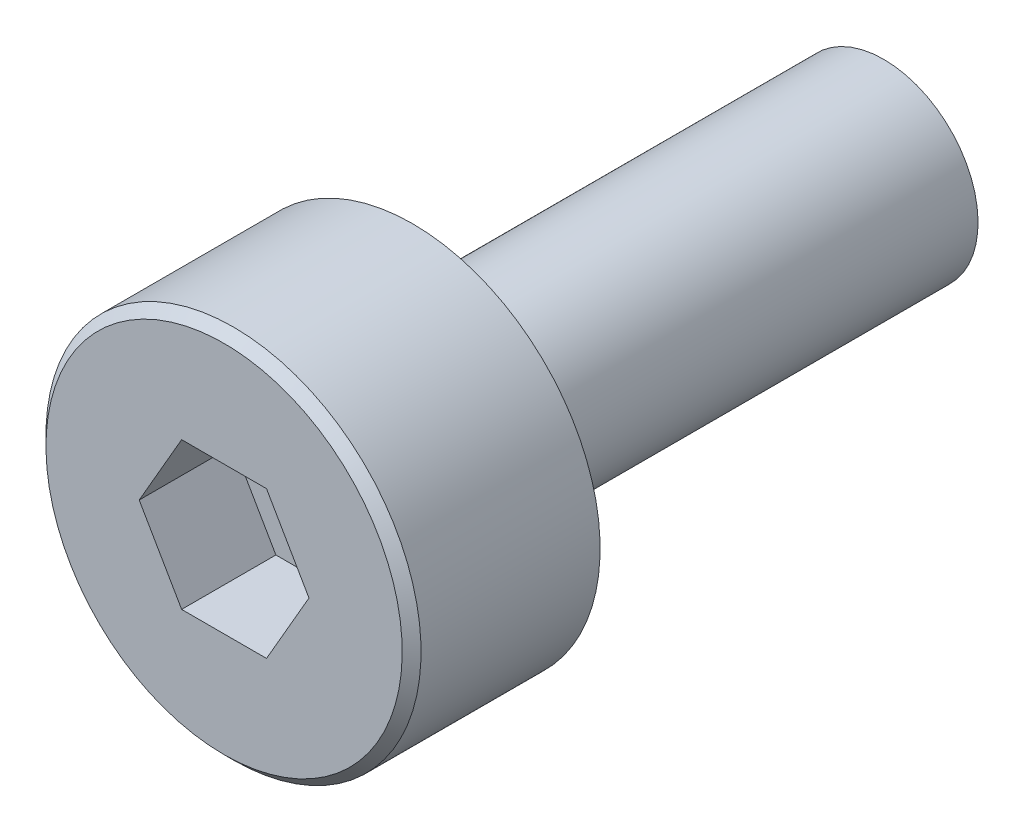
ISO-10303-21;
HEADER;
FILE_DESCRIPTION(('STEP AP214'),'2;1');
FILE_NAME('part.step','',(''),(''),'','','');
FILE_SCHEMA(('AUTOMOTIVE_DESIGN { 1 0 10303 214 1 1 1 1 }'));
ENDSEC;
DATA;
#1=APPLICATION_CONTEXT('core data for automotive mechanical design processes');
#2=APPLICATION_PROTOCOL_DEFINITION('international standard','automotive_design',2000,#1);
#3=PRODUCT_CONTEXT('',#1,'mechanical');
#4=PRODUCT('Part','Part','',(#3));
#5=PRODUCT_RELATED_PRODUCT_CATEGORY('part','',(#4));
#6=PRODUCT_DEFINITION_FORMATION('','',#4);
#7=PRODUCT_DEFINITION_CONTEXT('part definition',#1,'design');
#8=PRODUCT_DEFINITION('design','',#6,#7);
#9=PRODUCT_DEFINITION_SHAPE('','',#8);
#10=(LENGTH_UNIT() NAMED_UNIT(*) SI_UNIT(.MILLI.,.METRE.));
#11=(NAMED_UNIT(*) PLANE_ANGLE_UNIT() SI_UNIT($,.RADIAN.));
#12=(NAMED_UNIT(*) SI_UNIT($,.STERADIAN.) SOLID_ANGLE_UNIT());
#13=UNCERTAINTY_MEASURE_WITH_UNIT(LENGTH_MEASURE(1.E-05),#10,'distance_accuracy_value','');
#14=(GEOMETRIC_REPRESENTATION_CONTEXT(3) GLOBAL_UNCERTAINTY_ASSIGNED_CONTEXT((#13)) GLOBAL_UNIT_ASSIGNED_CONTEXT((#10,
#11,#12)) REPRESENTATION_CONTEXT('',''));
#15=CARTESIAN_POINT('',(0.,0.,0.));
#16=DIRECTION('',(0.,0.,1.));
#17=DIRECTION('',(1.,0.,0.));
#18=AXIS2_PLACEMENT_3D('',#15,#16,#17);
#19=CARTESIAN_POINT('',(0.,0.,0.));
#20=DIRECTION('',(0.,0.,1.));
#21=DIRECTION('',(0.,-1.,0.));
#22=AXIS2_PLACEMENT_3D('',#19,#20,#21);
#23=PLANE('',#22);
#24=CARTESIAN_POINT('',(0.,0.,0.));
#25=DIRECTION('',(0.,0.,1.));
#26=DIRECTION('',(0.,-1.,0.));
#27=AXIS2_PLACEMENT_3D('',#24,#25,#26);
#28=CIRCLE('',#27,1.89);
#29=CARTESIAN_POINT('',(0.,-1.89,0.));
#30=VERTEX_POINT('',#29);
#31=EDGE_CURVE('E11',#30,#30,#28,.T.);
#32=ORIENTED_EDGE('',*,*,#31,.T.);
#33=EDGE_LOOP('',(#32));
#34=FACE_BOUND('',#33,.T.);
#35=DIRECTION('',(-0.5,0.866025403784438,0.));
#36=VECTOR('',#35,1.);
#37=CARTESIAN_POINT('',(0.900666419935816,0.,0.));
#38=LINE('',#37,#36);
#39=CARTESIAN_POINT('',(0.900666419935816,0.,0.));
#40=VERTEX_POINT('',#39);
#41=CARTESIAN_POINT('',(0.450333209967908,0.779999999999999,0.));
#42=VERTEX_POINT('',#41);
#43=EDGE_CURVE('E63',#40,#42,#38,.T.);
#44=ORIENTED_EDGE('',*,*,#43,.F.);
#45=DIRECTION('',(0.5,0.866025403784439,0.));
#46=VECTOR('',#45,1.);
#47=CARTESIAN_POINT('',(0.450333209967908,-0.78,0.));
#48=LINE('',#47,#46);
#49=CARTESIAN_POINT('',(0.450333209967908,-0.78,0.));
#50=VERTEX_POINT('',#49);
#51=EDGE_CURVE('E156',#50,#40,#48,.T.);
#52=ORIENTED_EDGE('',*,*,#51,.F.);
#53=DIRECTION('',(1.,0.,0.));
#54=VECTOR('',#53,1.);
#55=CARTESIAN_POINT('',(-0.450333209967908,-0.78,0.));
#56=LINE('',#55,#54);
#57=CARTESIAN_POINT('',(-0.450333209967908,-0.78,0.));
#58=VERTEX_POINT('',#57);
#59=EDGE_CURVE('E153',#58,#50,#56,.T.);
#60=ORIENTED_EDGE('',*,*,#59,.F.);
#61=DIRECTION('',(0.5,-0.866025403784439,0.));
#62=VECTOR('',#61,1.);
#63=CARTESIAN_POINT('',(-0.900666419935816,0.,0.));
#64=LINE('',#63,#62);
#65=CARTESIAN_POINT('',(-0.900666419935816,0.,0.));
#66=VERTEX_POINT('',#65);
#67=EDGE_CURVE('E111',#66,#58,#64,.T.);
#68=ORIENTED_EDGE('',*,*,#67,.F.);
#69=DIRECTION('',(-0.5,-0.866025403784439,0.));
#70=VECTOR('',#69,1.);
#71=CARTESIAN_POINT('',(-0.450333209967908,0.78,0.));
#72=LINE('',#71,#70);
#73=CARTESIAN_POINT('',(-0.450333209967908,0.78,0.));
#74=VERTEX_POINT('',#73);
#75=EDGE_CURVE('E147',#74,#66,#72,.T.);
#76=ORIENTED_EDGE('',*,*,#75,.F.);
#77=DIRECTION('',(-1.,0.,0.));
#78=VECTOR('',#77,1.);
#79=CARTESIAN_POINT('',(0.450333209967908,0.779999999999999,0.));
#80=LINE('',#79,#78);
#81=EDGE_CURVE('E143',#42,#74,#80,.T.);
#82=ORIENTED_EDGE('',*,*,#81,.F.);
#83=EDGE_LOOP('',(#44,#52,#60,#68,#76,#82));
#84=FACE_BOUND('',#83,.T.);
#85=ADVANCED_FACE('F46',(#34,#84),#23,.T.);
#86=CARTESIAN_POINT('',(0.,0.,-7.));
#87=DIRECTION('',(0.,0.,-1.));
#88=DIRECTION('',(0.,1.,0.));
#89=AXIS2_PLACEMENT_3D('',#86,#87,#88);
#90=CYLINDRICAL_SURFACE('',#89,1.99);
#91=CARTESIAN_POINT('',(0.,0.,-0.0999999999999994));
#92=DIRECTION('',(0.,0.,1.));
#93=DIRECTION('',(0.,-1.,0.));
#94=AXIS2_PLACEMENT_3D('',#91,#92,#93);
#95=CIRCLE('',#94,1.99);
#96=CARTESIAN_POINT('',(0.,-1.99,-0.0999999999999994));
#97=VERTEX_POINT('',#96);
#98=EDGE_CURVE('E56',#97,#97,#95,.F.);
#99=ORIENTED_EDGE('',*,*,#98,.T.);
#100=EDGE_LOOP('',(#99));
#101=FACE_BOUND('',#100,.T.);
#102=CARTESIAN_POINT('',(0.,0.,-2.));
#103=DIRECTION('',(0.,0.,-1.));
#104=DIRECTION('',(0.,1.,0.));
#105=AXIS2_PLACEMENT_3D('',#102,#103,#104);
#106=CIRCLE('',#105,1.99);
#107=CARTESIAN_POINT('',(0.,1.99,-2.));
#108=VERTEX_POINT('',#107);
#109=EDGE_CURVE('E179',#108,#108,#106,.T.);
#110=ORIENTED_EDGE('',*,*,#109,.F.);
#111=EDGE_LOOP('',(#110));
#112=FACE_BOUND('',#111,.T.);
#113=ADVANCED_FACE('F186',(#101,#112),#90,.T.);
#114=CARTESIAN_POINT('',(0.,1.99,-2.));
#115=DIRECTION('',(0.,0.,-1.));
#116=DIRECTION('',(0.,1.,0.));
#117=AXIS2_PLACEMENT_3D('',#114,#115,#116);
#118=PLANE('',#117);
#119=ORIENTED_EDGE('',*,*,#109,.T.);
#120=EDGE_LOOP('',(#119));
#121=FACE_BOUND('',#120,.T.);
#122=CARTESIAN_POINT('',(0.,0.,-2.));
#123=DIRECTION('',(0.,0.,-1.));
#124=DIRECTION('',(0.,1.,0.));
#125=AXIS2_PLACEMENT_3D('',#122,#123,#124);
#126=CIRCLE('',#125,0.999999999999999);
#127=CARTESIAN_POINT('',(0.,0.999999999999999,-2.));
#128=VERTEX_POINT('',#127);
#129=EDGE_CURVE('E175',#128,#128,#126,.T.);
#130=ORIENTED_EDGE('',*,*,#129,.F.);
#131=EDGE_LOOP('',(#130));
#132=FACE_BOUND('',#131,.T.);
#133=ADVANCED_FACE('F202',(#121,#132),#118,.T.);
#134=CARTESIAN_POINT('',(0.,0.,-7.));
#135=DIRECTION('',(0.,0.,-1.));
#136=DIRECTION('',(0.,1.,0.));
#137=AXIS2_PLACEMENT_3D('',#134,#135,#136);
#138=CYLINDRICAL_SURFACE('',#137,0.999999999999999);
#139=ORIENTED_EDGE('',*,*,#129,.T.);
#140=EDGE_LOOP('',(#139));
#141=FACE_BOUND('',#140,.T.);
#142=CARTESIAN_POINT('',(0.,0.,-7.));
#143=DIRECTION('',(0.,0.,-1.));
#144=DIRECTION('',(0.,1.,0.));
#145=AXIS2_PLACEMENT_3D('',#142,#143,#144);
#146=CIRCLE('',#145,0.999999999999999);
#147=CARTESIAN_POINT('',(0.,0.999999999999999,-7.));
#148=VERTEX_POINT('',#147);
#149=EDGE_CURVE('E162',#148,#148,#146,.T.);
#150=ORIENTED_EDGE('',*,*,#149,.F.);
#151=EDGE_LOOP('',(#150));
#152=FACE_BOUND('',#151,.T.);
#153=ADVANCED_FACE('F208',(#141,#152),#138,.T.);
#154=CARTESIAN_POINT('',(0.,0.999999999999999,-7.));
#155=DIRECTION('',(0.,0.,-1.));
#156=DIRECTION('',(0.,1.,0.));
#157=AXIS2_PLACEMENT_3D('',#154,#155,#156);
#158=PLANE('',#157);
#159=ORIENTED_EDGE('',*,*,#149,.T.);
#160=EDGE_LOOP('',(#159));
#161=FACE_BOUND('',#160,.T.);
#162=ADVANCED_FACE('F212',(#161),#158,.T.);
#163=CARTESIAN_POINT('',(0.900666419935816,0.,-1.));
#164=DIRECTION('',(0.866025403784438,0.5,0.));
#165=DIRECTION('',(-0.5,0.866025403784439,0.));
#166=AXIS2_PLACEMENT_3D('',#163,#164,#165);
#167=PLANE('',#166);
#168=ORIENTED_EDGE('',*,*,#43,.T.);
#169=DIRECTION('',(0.,0.,1.));
#170=VECTOR('',#169,1.);
#171=CARTESIAN_POINT('',(0.450333209967908,0.779999999999999,-1.));
#172=LINE('',#171,#170);
#173=CARTESIAN_POINT('',(0.450333209967908,0.779999999999999,-1.));
#174=VERTEX_POINT('',#173);
#175=EDGE_CURVE('E93',#174,#42,#172,.T.);
#176=ORIENTED_EDGE('',*,*,#175,.F.);
#177=DIRECTION('',(-0.5,0.866025403784438,0.));
#178=VECTOR('',#177,1.);
#179=CARTESIAN_POINT('',(0.900666419935816,0.,-1.));
#180=LINE('',#179,#178);
#181=CARTESIAN_POINT('',(0.900666419935816,0.,-1.));
#182=VERTEX_POINT('',#181);
#183=EDGE_CURVE('E159',#182,#174,#180,.T.);
#184=ORIENTED_EDGE('',*,*,#183,.F.);
#185=DIRECTION('',(0.,0.,1.));
#186=VECTOR('',#185,1.);
#187=CARTESIAN_POINT('',(0.900666419935816,0.,-1.));
#188=LINE('',#187,#186);
#189=EDGE_CURVE('E71',#182,#40,#188,.T.);
#190=ORIENTED_EDGE('',*,*,#189,.T.);
#191=EDGE_LOOP('',(#168,#176,#184,#190));
#192=FACE_BOUND('',#191,.T.);
#193=ADVANCED_FACE('F216',(#192),#167,.F.);
#194=CARTESIAN_POINT('',(0.450333209967908,-0.78,-1.));
#195=DIRECTION('',(0.866025403784439,-0.5,0.));
#196=DIRECTION('',(0.5,0.866025403784439,0.));
#197=AXIS2_PLACEMENT_3D('',#194,#195,#196);
#198=PLANE('',#197);
#199=ORIENTED_EDGE('',*,*,#51,.T.);
#200=ORIENTED_EDGE('',*,*,#189,.F.);
#201=DIRECTION('',(0.5,0.866025403784439,0.));
#202=VECTOR('',#201,1.);
#203=CARTESIAN_POINT('',(0.450333209967908,-0.78,-1.));
#204=LINE('',#203,#202);
#205=CARTESIAN_POINT('',(0.450333209967908,-0.78,-1.));
#206=VERTEX_POINT('',#205);
#207=EDGE_CURVE('E125',#206,#182,#204,.T.);
#208=ORIENTED_EDGE('',*,*,#207,.F.);
#209=DIRECTION('',(0.,0.,1.));
#210=VECTOR('',#209,1.);
#211=CARTESIAN_POINT('',(0.450333209967908,-0.78,-1.));
#212=LINE('',#211,#210);
#213=EDGE_CURVE('E116',#206,#50,#212,.T.);
#214=ORIENTED_EDGE('',*,*,#213,.T.);
#215=EDGE_LOOP('',(#199,#200,#208,#214));
#216=FACE_BOUND('',#215,.T.);
#217=ADVANCED_FACE('F220',(#216),#198,.F.);
#218=CARTESIAN_POINT('',(-0.450333209967908,-0.78,-1.));
#219=DIRECTION('',(0.,-1.,0.));
#220=DIRECTION('',(1.,0.,0.));
#221=AXIS2_PLACEMENT_3D('',#218,#219,#220);
#222=PLANE('',#221);
#223=ORIENTED_EDGE('',*,*,#59,.T.);
#224=ORIENTED_EDGE('',*,*,#213,.F.);
#225=DIRECTION('',(1.,0.,0.));
#226=VECTOR('',#225,1.);
#227=CARTESIAN_POINT('',(-0.450333209967908,-0.78,-1.));
#228=LINE('',#227,#226);
#229=CARTESIAN_POINT('',(-0.450333209967908,-0.78,-1.));
#230=VERTEX_POINT('',#229);
#231=EDGE_CURVE('E120',#230,#206,#228,.T.);
#232=ORIENTED_EDGE('',*,*,#231,.F.);
#233=DIRECTION('',(0.,0.,1.));
#234=VECTOR('',#233,1.);
#235=CARTESIAN_POINT('',(-0.450333209967908,-0.78,-1.));
#236=LINE('',#235,#234);
#237=EDGE_CURVE('E104',#230,#58,#236,.T.);
#238=ORIENTED_EDGE('',*,*,#237,.T.);
#239=EDGE_LOOP('',(#223,#224,#232,#238));
#240=FACE_BOUND('',#239,.T.);
#241=ADVANCED_FACE('F121',(#240),#222,.F.);
#242=CARTESIAN_POINT('',(-0.900666419935816,0.,-1.));
#243=DIRECTION('',(-0.866025403784439,-0.5,0.));
#244=DIRECTION('',(0.5,-0.866025403784439,0.));
#245=AXIS2_PLACEMENT_3D('',#242,#243,#244);
#246=PLANE('',#245);
#247=ORIENTED_EDGE('',*,*,#67,.T.);
#248=ORIENTED_EDGE('',*,*,#237,.F.);
#249=DIRECTION('',(0.5,-0.866025403784439,0.));
#250=VECTOR('',#249,1.);
#251=CARTESIAN_POINT('',(-0.900666419935816,0.,-1.));
#252=LINE('',#251,#250);
#253=CARTESIAN_POINT('',(-0.900666419935816,0.,-1.));
#254=VERTEX_POINT('',#253);
#255=EDGE_CURVE('E108',#254,#230,#252,.T.);
#256=ORIENTED_EDGE('',*,*,#255,.F.);
#257=DIRECTION('',(0.,0.,1.));
#258=VECTOR('',#257,1.);
#259=CARTESIAN_POINT('',(-0.900666419935816,0.,-1.));
#260=LINE('',#259,#258);
#261=EDGE_CURVE('E117',#254,#66,#260,.T.);
#262=ORIENTED_EDGE('',*,*,#261,.T.);
#263=EDGE_LOOP('',(#247,#248,#256,#262));
#264=FACE_BOUND('',#263,.T.);
#265=ADVANCED_FACE('F106',(#264),#246,.F.);
#266=CARTESIAN_POINT('',(-0.450333209967908,0.78,-1.));
#267=DIRECTION('',(-0.866025403784439,0.5,0.));
#268=DIRECTION('',(-0.5,-0.866025403784439,0.));
#269=AXIS2_PLACEMENT_3D('',#266,#267,#268);
#270=PLANE('',#269);
#271=ORIENTED_EDGE('',*,*,#75,.T.);
#272=ORIENTED_EDGE('',*,*,#261,.F.);
#273=DIRECTION('',(-0.5,-0.866025403784439,0.));
#274=VECTOR('',#273,1.);
#275=CARTESIAN_POINT('',(-0.450333209967908,0.78,-1.));
#276=LINE('',#275,#274);
#277=CARTESIAN_POINT('',(-0.450333209967908,0.78,-1.));
#278=VERTEX_POINT('',#277);
#279=EDGE_CURVE('E131',#278,#254,#276,.T.);
#280=ORIENTED_EDGE('',*,*,#279,.F.);
#281=DIRECTION('',(0.,0.,1.));
#282=VECTOR('',#281,1.);
#283=CARTESIAN_POINT('',(-0.450333209967908,0.78,-1.));
#284=LINE('',#283,#282);
#285=EDGE_CURVE('E167',#278,#74,#284,.T.);
#286=ORIENTED_EDGE('',*,*,#285,.T.);
#287=EDGE_LOOP('',(#271,#272,#280,#286));
#288=FACE_BOUND('',#287,.T.);
#289=ADVANCED_FACE('F223',(#288),#270,.F.);
#290=CARTESIAN_POINT('',(0.450333209967908,0.779999999999999,-1.));
#291=DIRECTION('',(0.,1.,0.));
#292=DIRECTION('',(-1.,0.,0.));
#293=AXIS2_PLACEMENT_3D('',#290,#291,#292);
#294=PLANE('',#293);
#295=ORIENTED_EDGE('',*,*,#81,.T.);
#296=ORIENTED_EDGE('',*,*,#285,.F.);
#297=DIRECTION('',(-1.,0.,0.));
#298=VECTOR('',#297,1.);
#299=CARTESIAN_POINT('',(0.450333209967908,0.779999999999999,-1.));
#300=LINE('',#299,#298);
#301=EDGE_CURVE('E135',#174,#278,#300,.T.);
#302=ORIENTED_EDGE('',*,*,#301,.F.);
#303=ORIENTED_EDGE('',*,*,#175,.T.);
#304=EDGE_LOOP('',(#295,#296,#302,#303));
#305=FACE_BOUND('',#304,.T.);
#306=ADVANCED_FACE('F194',(#305),#294,.F.);
#307=CARTESIAN_POINT('',(0.,0.,-1.));
#308=DIRECTION('',(0.,0.,1.));
#309=DIRECTION('',(1.,0.,0.));
#310=AXIS2_PLACEMENT_3D('',#307,#308,#309);
#311=PLANE('',#310);
#312=ORIENTED_EDGE('',*,*,#183,.T.);
#313=ORIENTED_EDGE('',*,*,#301,.T.);
#314=ORIENTED_EDGE('',*,*,#279,.T.);
#315=ORIENTED_EDGE('',*,*,#255,.T.);
#316=ORIENTED_EDGE('',*,*,#231,.T.);
#317=ORIENTED_EDGE('',*,*,#207,.T.);
#318=EDGE_LOOP('',(#312,#313,#314,#315,#316,#317));
#319=FACE_BOUND('',#318,.T.);
#320=ADVANCED_FACE('F128',(#319),#311,.T.);
#321=CARTESIAN_POINT('',(0.,0.,-0.0999999999999994));
#322=DIRECTION('',(0.,0.,-1.));
#323=DIRECTION('',(0.,1.,0.));
#324=AXIS2_PLACEMENT_3D('',#321,#322,#323);
#325=CONICAL_SURFACE('',#324,1.99,0.78539816339745);
#326=ORIENTED_EDGE('',*,*,#31,.F.);
#327=EDGE_LOOP('',(#326));
#328=FACE_BOUND('',#327,.T.);
#329=ORIENTED_EDGE('',*,*,#98,.F.);
#330=EDGE_LOOP('',(#329));
#331=FACE_BOUND('',#330,.T.);
#332=ADVANCED_FACE('F49',(#328,#331),#325,.T.);
#333=CLOSED_SHELL('',(#85,#113,#133,#153,#162,#193,#217,#241,#265,#289,#306,#320,#332));
#334=MANIFOLD_SOLID_BREP('B2',#333);
#335=ADVANCED_BREP_SHAPE_REPRESENTATION('',(#18,#334),#14);
#336=SHAPE_DEFINITION_REPRESENTATION(#9,#335);
ENDSEC;
END-ISO-10303-21;
